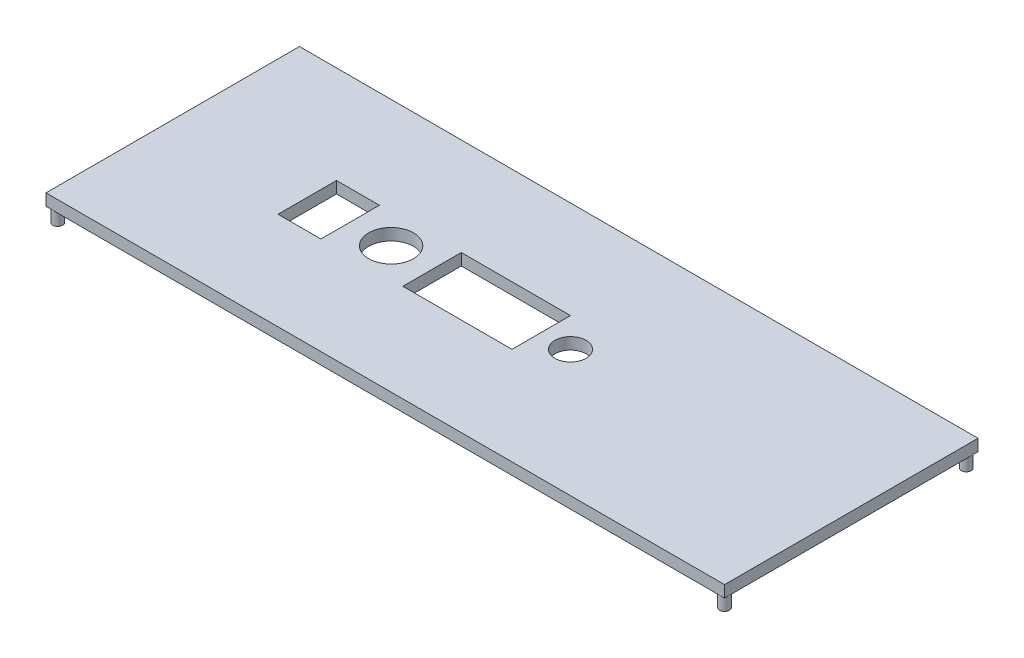
ISO-10303-21;
HEADER;
FILE_DESCRIPTION(('STEP AP214'),'2;1');
FILE_NAME('part.step','',(''),(''),'','','');
FILE_SCHEMA(('AUTOMOTIVE_DESIGN { 1 0 10303 214 1 1 1 1 }'));
ENDSEC;
DATA;
#1=APPLICATION_CONTEXT('core data for automotive mechanical design processes');
#2=APPLICATION_PROTOCOL_DEFINITION('international standard','automotive_design',2000,#1);
#3=PRODUCT_CONTEXT('',#1,'mechanical');
#4=PRODUCT('Part','Part','',(#3));
#5=PRODUCT_RELATED_PRODUCT_CATEGORY('part','',(#4));
#6=PRODUCT_DEFINITION_FORMATION('','',#4);
#7=PRODUCT_DEFINITION_CONTEXT('part definition',#1,'design');
#8=PRODUCT_DEFINITION('design','',#6,#7);
#9=PRODUCT_DEFINITION_SHAPE('','',#8);
#10=(LENGTH_UNIT() NAMED_UNIT(*) SI_UNIT(.MILLI.,.METRE.));
#11=(NAMED_UNIT(*) PLANE_ANGLE_UNIT() SI_UNIT($,.RADIAN.));
#12=(NAMED_UNIT(*) SI_UNIT($,.STERADIAN.) SOLID_ANGLE_UNIT());
#13=UNCERTAINTY_MEASURE_WITH_UNIT(LENGTH_MEASURE(1.E-05),#10,'distance_accuracy_value','');
#14=(GEOMETRIC_REPRESENTATION_CONTEXT(3) GLOBAL_UNCERTAINTY_ASSIGNED_CONTEXT((#13)) GLOBAL_UNIT_ASSIGNED_CONTEXT((#10,
#11,#12)) REPRESENTATION_CONTEXT('',''));
#15=CARTESIAN_POINT('',(0.,0.,0.));
#16=DIRECTION('',(0.,0.,1.));
#17=DIRECTION('',(1.,0.,0.));
#18=AXIS2_PLACEMENT_3D('',#15,#16,#17);
#19=CARTESIAN_POINT('',(108.565352112676,-3.5,29.2801408450704));
#20=DIRECTION('',(0.,-1.,0.));
#21=DIRECTION('',(0.,0.,-1.));
#22=AXIS2_PLACEMENT_3D('',#19,#20,#21);
#23=PLANE('',#22);
#24=CARTESIAN_POINT('',(108.565352112676,-3.5,29.2801408450704));
#25=DIRECTION('',(0.,-1.,0.));
#26=DIRECTION('',(0.,0.,-1.));
#27=AXIS2_PLACEMENT_3D('',#24,#25,#26);
#28=CIRCLE('',#27,1.25);
#29=CARTESIAN_POINT('',(108.565352112676,-3.5,28.0301408450704));
#30=VERTEX_POINT('',#29);
#31=EDGE_CURVE('E11',#30,#30,#28,.T.);
#32=ORIENTED_EDGE('',*,*,#31,.T.);
#33=EDGE_LOOP('',(#32));
#34=FACE_BOUND('',#33,.T.);
#35=ADVANCED_FACE('F33',(#34),#23,.T.);
#36=CARTESIAN_POINT('',(108.565352112676,-3.5,29.2801408450704));
#37=DIRECTION('',(0.,1.,0.));
#38=DIRECTION('',(0.,0.,1.));
#39=AXIS2_PLACEMENT_3D('',#36,#37,#38);
#40=CYLINDRICAL_SURFACE('',#39,1.25);
#41=ORIENTED_EDGE('',*,*,#31,.F.);
#42=EDGE_LOOP('',(#41));
#43=FACE_BOUND('',#42,.T.);
#44=CARTESIAN_POINT('',(108.565352112676,0.,29.2801408450704));
#45=DIRECTION('',(0.,1.,0.));
#46=DIRECTION('',(0.,0.,1.));
#47=AXIS2_PLACEMENT_3D('',#44,#45,#46);
#48=CIRCLE('',#47,1.25);
#49=CARTESIAN_POINT('',(108.565352112676,0.,30.5301408450704));
#50=VERTEX_POINT('',#49);
#51=EDGE_CURVE('E40',#50,#50,#48,.F.);
#52=ORIENTED_EDGE('',*,*,#51,.T.);
#53=EDGE_LOOP('',(#52));
#54=FACE_BOUND('',#53,.T.);
#55=ADVANCED_FACE('F245',(#43,#54),#40,.T.);
#56=CARTESIAN_POINT('',(-62.434647887324,-3.5,29.2801408450704));
#57=DIRECTION('',(0.,-1.,0.));
#58=DIRECTION('',(0.,0.,-1.));
#59=AXIS2_PLACEMENT_3D('',#56,#57,#58);
#60=PLANE('',#59);
#61=CARTESIAN_POINT('',(-62.434647887324,-3.5,29.2801408450704));
#62=DIRECTION('',(0.,-1.,0.));
#63=DIRECTION('',(0.,0.,-1.));
#64=AXIS2_PLACEMENT_3D('',#61,#62,#63);
#65=CIRCLE('',#64,1.25);
#66=CARTESIAN_POINT('',(-62.434647887324,-3.5,28.0301408450704));
#67=VERTEX_POINT('',#66);
#68=EDGE_CURVE('E240',#67,#67,#65,.T.);
#69=ORIENTED_EDGE('',*,*,#68,.T.);
#70=EDGE_LOOP('',(#69));
#71=FACE_BOUND('',#70,.T.);
#72=ADVANCED_FACE('F269',(#71),#60,.T.);
#73=CARTESIAN_POINT('',(-62.434647887324,-3.5,29.2801408450704));
#74=DIRECTION('',(0.,1.,0.));
#75=DIRECTION('',(0.,0.,1.));
#76=AXIS2_PLACEMENT_3D('',#73,#74,#75);
#77=CYLINDRICAL_SURFACE('',#76,1.25);
#78=ORIENTED_EDGE('',*,*,#68,.F.);
#79=EDGE_LOOP('',(#78));
#80=FACE_BOUND('',#79,.T.);
#81=CARTESIAN_POINT('',(-62.434647887324,0.,29.2801408450704));
#82=DIRECTION('',(0.,1.,0.));
#83=DIRECTION('',(0.,0.,1.));
#84=AXIS2_PLACEMENT_3D('',#81,#82,#83);
#85=CIRCLE('',#84,1.25);
#86=CARTESIAN_POINT('',(-62.434647887324,0.,30.5301408450704));
#87=VERTEX_POINT('',#86);
#88=EDGE_CURVE('E237',#87,#87,#85,.F.);
#89=ORIENTED_EDGE('',*,*,#88,.T.);
#90=EDGE_LOOP('',(#89));
#91=FACE_BOUND('',#90,.T.);
#92=ADVANCED_FACE('F275',(#80,#91),#77,.T.);
#93=CARTESIAN_POINT('',(-64.024647887324,3.,-34.3098591549296));
#94=DIRECTION('',(1.,0.,0.));
#95=DIRECTION('',(0.,0.,-1.));
#96=AXIS2_PLACEMENT_3D('',#93,#94,#95);
#97=PLANE('',#96);
#98=DIRECTION('',(0.,0.,1.));
#99=VECTOR('',#98,1.);
#100=CARTESIAN_POINT('',(-64.024647887324,0.,-34.3098591549296));
#101=LINE('',#100,#99);
#102=CARTESIAN_POINT('',(-64.024647887324,0.,-34.3098591549296));
#103=VERTEX_POINT('',#102);
#104=CARTESIAN_POINT('',(-64.024647887324,0.,30.6901408450704));
#105=VERTEX_POINT('',#104);
#106=EDGE_CURVE('E211',#103,#105,#101,.T.);
#107=ORIENTED_EDGE('',*,*,#106,.T.);
#108=DIRECTION('',(0.,-1.,0.));
#109=VECTOR('',#108,1.);
#110=CARTESIAN_POINT('',(-64.024647887324,3.,30.6901408450704));
#111=LINE('',#110,#109);
#112=CARTESIAN_POINT('',(-64.024647887324,3.,30.6901408450704));
#113=VERTEX_POINT('',#112);
#114=EDGE_CURVE('E228',#113,#105,#111,.T.);
#115=ORIENTED_EDGE('',*,*,#114,.F.);
#116=DIRECTION('',(0.,0.,1.));
#117=VECTOR('',#116,1.);
#118=CARTESIAN_POINT('',(-64.024647887324,3.,-34.3098591549296));
#119=LINE('',#118,#117);
#120=CARTESIAN_POINT('',(-64.024647887324,3.,-34.3098591549296));
#121=VERTEX_POINT('',#120);
#122=EDGE_CURVE('E200',#121,#113,#119,.T.);
#123=ORIENTED_EDGE('',*,*,#122,.F.);
#124=DIRECTION('',(0.,-1.,0.));
#125=VECTOR('',#124,1.);
#126=CARTESIAN_POINT('',(-64.024647887324,3.,-34.3098591549296));
#127=LINE('',#126,#125);
#128=EDGE_CURVE('E210',#121,#103,#127,.T.);
#129=ORIENTED_EDGE('',*,*,#128,.T.);
#130=EDGE_LOOP('',(#107,#115,#123,#129));
#131=FACE_BOUND('',#130,.T.);
#132=ADVANCED_FACE('F281',(#131),#97,.F.);
#133=CARTESIAN_POINT('',(-64.024647887324,3.,30.6901408450704));
#134=DIRECTION('',(0.,0.,-1.));
#135=DIRECTION('',(-1.,0.,0.));
#136=AXIS2_PLACEMENT_3D('',#133,#134,#135);
#137=PLANE('',#136);
#138=DIRECTION('',(1.,0.,0.));
#139=VECTOR('',#138,1.);
#140=CARTESIAN_POINT('',(-64.024647887324,0.,30.6901408450704));
#141=LINE('',#140,#139);
#142=CARTESIAN_POINT('',(109.975352112676,0.,30.6901408450704));
#143=VERTEX_POINT('',#142);
#144=EDGE_CURVE('E214',#105,#143,#141,.T.);
#145=ORIENTED_EDGE('',*,*,#144,.T.);
#146=DIRECTION('',(0.,-1.,0.));
#147=VECTOR('',#146,1.);
#148=CARTESIAN_POINT('',(109.975352112676,3.,30.6901408450704));
#149=LINE('',#148,#147);
#150=CARTESIAN_POINT('',(109.975352112676,3.,30.6901408450704));
#151=VERTEX_POINT('',#150);
#152=EDGE_CURVE('E225',#151,#143,#149,.T.);
#153=ORIENTED_EDGE('',*,*,#152,.F.);
#154=DIRECTION('',(1.,0.,0.));
#155=VECTOR('',#154,1.);
#156=CARTESIAN_POINT('',(-64.024647887324,3.,30.6901408450704));
#157=LINE('',#156,#155);
#158=EDGE_CURVE('E203',#113,#151,#157,.T.);
#159=ORIENTED_EDGE('',*,*,#158,.F.);
#160=ORIENTED_EDGE('',*,*,#114,.T.);
#161=EDGE_LOOP('',(#145,#153,#159,#160));
#162=FACE_BOUND('',#161,.T.);
#163=ADVANCED_FACE('F285',(#162),#137,.F.);
#164=CARTESIAN_POINT('',(109.975352112676,3.,-34.3098591549296));
#165=DIRECTION('',(-1.,0.,0.));
#166=DIRECTION('',(0.,0.,1.));
#167=AXIS2_PLACEMENT_3D('',#164,#165,#166);
#168=PLANE('',#167);
#169=DIRECTION('',(0.,0.,-1.));
#170=VECTOR('',#169,1.);
#171=CARTESIAN_POINT('',(109.975352112676,0.,-34.3098591549296));
#172=LINE('',#171,#170);
#173=CARTESIAN_POINT('',(109.975352112676,0.,-34.3098591549296));
#174=VERTEX_POINT('',#173);
#175=EDGE_CURVE('E217',#143,#174,#172,.T.);
#176=ORIENTED_EDGE('',*,*,#175,.T.);
#177=DIRECTION('',(0.,-1.,0.));
#178=VECTOR('',#177,1.);
#179=CARTESIAN_POINT('',(109.975352112676,3.,-34.3098591549296));
#180=LINE('',#179,#178);
#181=CARTESIAN_POINT('',(109.975352112676,3.,-34.3098591549296));
#182=VERTEX_POINT('',#181);
#183=EDGE_CURVE('E222',#182,#174,#180,.T.);
#184=ORIENTED_EDGE('',*,*,#183,.F.);
#185=DIRECTION('',(0.,0.,-1.));
#186=VECTOR('',#185,1.);
#187=CARTESIAN_POINT('',(109.975352112676,3.,-34.3098591549296));
#188=LINE('',#187,#186);
#189=EDGE_CURVE('E206',#151,#182,#188,.T.);
#190=ORIENTED_EDGE('',*,*,#189,.F.);
#191=ORIENTED_EDGE('',*,*,#152,.T.);
#192=EDGE_LOOP('',(#176,#184,#190,#191));
#193=FACE_BOUND('',#192,.T.);
#194=ADVANCED_FACE('F289',(#193),#168,.F.);
#195=CARTESIAN_POINT('',(-64.024647887324,3.,-34.3098591549296));
#196=DIRECTION('',(0.,0.,1.));
#197=DIRECTION('',(1.,0.,0.));
#198=AXIS2_PLACEMENT_3D('',#195,#196,#197);
#199=PLANE('',#198);
#200=DIRECTION('',(-1.,0.,0.));
#201=VECTOR('',#200,1.);
#202=CARTESIAN_POINT('',(-64.024647887324,0.,-34.3098591549296));
#203=LINE('',#202,#201);
#204=EDGE_CURVE('E204',#174,#103,#203,.T.);
#205=ORIENTED_EDGE('',*,*,#204,.T.);
#206=ORIENTED_EDGE('',*,*,#128,.F.);
#207=DIRECTION('',(-1.,0.,0.));
#208=VECTOR('',#207,1.);
#209=CARTESIAN_POINT('',(-64.024647887324,3.,-34.3098591549296));
#210=LINE('',#209,#208);
#211=EDGE_CURVE('E208',#182,#121,#210,.T.);
#212=ORIENTED_EDGE('',*,*,#211,.F.);
#213=ORIENTED_EDGE('',*,*,#183,.T.);
#214=EDGE_LOOP('',(#205,#206,#212,#213));
#215=FACE_BOUND('',#214,.T.);
#216=ADVANCED_FACE('F258',(#215),#199,.F.);
#217=CARTESIAN_POINT('',(0.,3.,0.));
#218=DIRECTION('',(0.,1.,0.));
#219=DIRECTION('',(0.,0.,1.));
#220=AXIS2_PLACEMENT_3D('',#217,#218,#219);
#221=PLANE('',#220);
#222=CARTESIAN_POINT('',(37.975352112676,3.,-1.80985915492958));
#223=DIRECTION('',(0.,1.,0.));
#224=DIRECTION('',(0.,0.,1.));
#225=AXIS2_PLACEMENT_3D('',#222,#223,#224);
#226=CIRCLE('',#225,4.00000000000001);
#227=CARTESIAN_POINT('',(37.975352112676,3.,2.19014084507043));
#228=VERTEX_POINT('',#227);
#229=EDGE_CURVE('E148',#228,#228,#226,.T.);
#230=ORIENTED_EDGE('',*,*,#229,.F.);
#231=EDGE_LOOP('',(#230));
#232=FACE_BOUND('',#231,.T.);
#233=DIRECTION('',(0.,0.,-1.));
#234=VECTOR('',#233,1.);
#235=CARTESIAN_POINT('',(30.475352112676,3.,5.69014084507042));
#236=LINE('',#235,#234);
#237=CARTESIAN_POINT('',(30.475352112676,3.,5.69014084507042));
#238=VERTEX_POINT('',#237);
#239=CARTESIAN_POINT('',(30.475352112676,3.,-9.30985915492958));
#240=VERTEX_POINT('',#239);
#241=EDGE_CURVE('E47',#238,#240,#236,.T.);
#242=ORIENTED_EDGE('',*,*,#241,.F.);
#243=DIRECTION('',(1.,0.,0.));
#244=VECTOR('',#243,1.);
#245=CARTESIAN_POINT('',(2.47535211267602,3.,5.69014084507042));
#246=LINE('',#245,#244);
#247=CARTESIAN_POINT('',(2.47535211267602,3.,5.69014084507042));
#248=VERTEX_POINT('',#247);
#249=EDGE_CURVE('E142',#248,#238,#246,.T.);
#250=ORIENTED_EDGE('',*,*,#249,.F.);
#251=DIRECTION('',(0.,0.,1.));
#252=VECTOR('',#251,1.);
#253=CARTESIAN_POINT('',(2.47535211267602,3.,5.69014084507042));
#254=LINE('',#253,#252);
#255=CARTESIAN_POINT('',(2.47535211267602,3.,-9.30985915492958));
#256=VERTEX_POINT('',#255);
#257=EDGE_CURVE('E145',#256,#248,#254,.T.);
#258=ORIENTED_EDGE('',*,*,#257,.F.);
#259=DIRECTION('',(-1.,0.,0.));
#260=VECTOR('',#259,1.);
#261=CARTESIAN_POINT('',(2.47535211267602,3.,-9.30985915492958));
#262=LINE('',#261,#260);
#263=EDGE_CURVE('E154',#240,#256,#262,.T.);
#264=ORIENTED_EDGE('',*,*,#263,.F.);
#265=EDGE_LOOP('',(#242,#250,#258,#264));
#266=FACE_BOUND('',#265,.T.);
#267=CARTESIAN_POINT('',(-8.02464788732397,3.,-1.80985915492958));
#268=DIRECTION('',(0.,1.,0.));
#269=DIRECTION('',(0.,0.,1.));
#270=AXIS2_PLACEMENT_3D('',#267,#268,#269);
#271=CIRCLE('',#270,5.75);
#272=CARTESIAN_POINT('',(-8.02464788732397,3.,3.94014084507042));
#273=VERTEX_POINT('',#272);
#274=EDGE_CURVE('E166',#273,#273,#271,.T.);
#275=ORIENTED_EDGE('',*,*,#274,.F.);
#276=EDGE_LOOP('',(#275));
#277=FACE_BOUND('',#276,.T.);
#278=DIRECTION('',(0.,0.,-1.));
#279=VECTOR('',#278,1.);
#280=CARTESIAN_POINT('',(-18.524647887324,3.,5.69014084507042));
#281=LINE('',#280,#279);
#282=CARTESIAN_POINT('',(-18.524647887324,3.,5.69014084507042));
#283=VERTEX_POINT('',#282);
#284=CARTESIAN_POINT('',(-18.524647887324,3.,-9.30985915492958));
#285=VERTEX_POINT('',#284);
#286=EDGE_CURVE('E55',#283,#285,#281,.T.);
#287=ORIENTED_EDGE('',*,*,#286,.F.);
#288=DIRECTION('',(1.,0.,0.));
#289=VECTOR('',#288,1.);
#290=CARTESIAN_POINT('',(-29.524647887324,3.,5.69014084507042));
#291=LINE('',#290,#289);
#292=CARTESIAN_POINT('',(-29.524647887324,3.,5.69014084507042));
#293=VERTEX_POINT('',#292);
#294=EDGE_CURVE('E174',#293,#283,#291,.T.);
#295=ORIENTED_EDGE('',*,*,#294,.F.);
#296=DIRECTION('',(0.,0.,1.));
#297=VECTOR('',#296,1.);
#298=CARTESIAN_POINT('',(-29.524647887324,3.,5.69014084507042));
#299=LINE('',#298,#297);
#300=CARTESIAN_POINT('',(-29.524647887324,3.,-9.30985915492958));
#301=VERTEX_POINT('',#300);
#302=EDGE_CURVE('E189',#301,#293,#299,.T.);
#303=ORIENTED_EDGE('',*,*,#302,.F.);
#304=DIRECTION('',(-1.,0.,0.));
#305=VECTOR('',#304,1.);
#306=CARTESIAN_POINT('',(-29.524647887324,3.,-9.30985915492958));
#307=LINE('',#306,#305);
#308=EDGE_CURVE('E185',#285,#301,#307,.T.);
#309=ORIENTED_EDGE('',*,*,#308,.F.);
#310=EDGE_LOOP('',(#287,#295,#303,#309));
#311=FACE_BOUND('',#310,.T.);
#312=ORIENTED_EDGE('',*,*,#122,.T.);
#313=ORIENTED_EDGE('',*,*,#158,.T.);
#314=ORIENTED_EDGE('',*,*,#189,.T.);
#315=ORIENTED_EDGE('',*,*,#211,.T.);
#316=EDGE_LOOP('',(#312,#313,#314,#315));
#317=FACE_BOUND('',#316,.T.);
#318=ADVANCED_FACE('F249',(#232,#266,#277,#311,#317),#221,.T.);
#319=CARTESIAN_POINT('',(0.,0.,0.));
#320=DIRECTION('',(0.,1.,0.));
#321=DIRECTION('',(0.,0.,1.));
#322=AXIS2_PLACEMENT_3D('',#319,#320,#321);
#323=PLANE('',#322);
#324=CARTESIAN_POINT('',(108.565352112676,0.,-32.7198591549296));
#325=DIRECTION('',(0.,1.,0.));
#326=DIRECTION('',(0.,0.,1.));
#327=AXIS2_PLACEMENT_3D('',#324,#325,#326);
#328=CIRCLE('',#327,1.25);
#329=CARTESIAN_POINT('',(108.565352112676,0.,-31.4698591549296));
#330=VERTEX_POINT('',#329);
#331=EDGE_CURVE('E234',#330,#330,#328,.F.);
#332=ORIENTED_EDGE('',*,*,#331,.F.);
#333=EDGE_LOOP('',(#332));
#334=FACE_BOUND('',#333,.T.);
#335=CARTESIAN_POINT('',(-62.434647887324,0.,-32.7198591549296));
#336=DIRECTION('',(0.,1.,0.));
#337=DIRECTION('',(0.,0.,1.));
#338=AXIS2_PLACEMENT_3D('',#335,#336,#337);
#339=CIRCLE('',#338,1.25);
#340=CARTESIAN_POINT('',(-62.434647887324,0.,-31.4698591549296));
#341=VERTEX_POINT('',#340);
#342=EDGE_CURVE('E231',#341,#341,#339,.F.);
#343=ORIENTED_EDGE('',*,*,#342,.F.);
#344=EDGE_LOOP('',(#343));
#345=FACE_BOUND('',#344,.T.);
#346=CARTESIAN_POINT('',(37.975352112676,0.,-1.80985915492958));
#347=DIRECTION('',(0.,1.,0.));
#348=DIRECTION('',(0.,0.,1.));
#349=AXIS2_PLACEMENT_3D('',#346,#347,#348);
#350=CIRCLE('',#349,4.00000000000001);
#351=CARTESIAN_POINT('',(37.975352112676,0.,2.19014084507043));
#352=VERTEX_POINT('',#351);
#353=EDGE_CURVE('E215',#352,#352,#350,.T.);
#354=ORIENTED_EDGE('',*,*,#353,.T.);
#355=EDGE_LOOP('',(#354));
#356=FACE_BOUND('',#355,.T.);
#357=DIRECTION('',(1.,0.,0.));
#358=VECTOR('',#357,1.);
#359=CARTESIAN_POINT('',(2.47535211267602,0.,5.69014084507042));
#360=LINE('',#359,#358);
#361=CARTESIAN_POINT('',(2.47535211267602,0.,5.69014084507042));
#362=VERTEX_POINT('',#361);
#363=CARTESIAN_POINT('',(30.475352112676,0.,5.69014084507042));
#364=VERTEX_POINT('',#363);
#365=EDGE_CURVE('E129',#362,#364,#360,.T.);
#366=ORIENTED_EDGE('',*,*,#365,.T.);
#367=DIRECTION('',(0.,0.,-1.));
#368=VECTOR('',#367,1.);
#369=CARTESIAN_POINT('',(30.475352112676,0.,5.69014084507042));
#370=LINE('',#369,#368);
#371=CARTESIAN_POINT('',(30.475352112676,0.,-9.30985915492958));
#372=VERTEX_POINT('',#371);
#373=EDGE_CURVE('E123',#364,#372,#370,.T.);
#374=ORIENTED_EDGE('',*,*,#373,.T.);
#375=DIRECTION('',(-1.,0.,0.));
#376=VECTOR('',#375,1.);
#377=CARTESIAN_POINT('',(2.47535211267602,0.,-9.30985915492958));
#378=LINE('',#377,#376);
#379=CARTESIAN_POINT('',(2.47535211267602,0.,-9.30985915492958));
#380=VERTEX_POINT('',#379);
#381=EDGE_CURVE('E133',#372,#380,#378,.T.);
#382=ORIENTED_EDGE('',*,*,#381,.T.);
#383=DIRECTION('',(0.,0.,1.));
#384=VECTOR('',#383,1.);
#385=CARTESIAN_POINT('',(2.47535211267602,0.,5.69014084507042));
#386=LINE('',#385,#384);
#387=EDGE_CURVE('E137',#380,#362,#386,.T.);
#388=ORIENTED_EDGE('',*,*,#387,.T.);
#389=EDGE_LOOP('',(#366,#374,#382,#388));
#390=FACE_BOUND('',#389,.T.);
#391=CARTESIAN_POINT('',(-8.02464788732397,0.,-1.80985915492958));
#392=DIRECTION('',(0.,1.,0.));
#393=DIRECTION('',(0.,0.,1.));
#394=AXIS2_PLACEMENT_3D('',#391,#392,#393);
#395=CIRCLE('',#394,5.75);
#396=CARTESIAN_POINT('',(-8.02464788732397,0.,3.94014084507042));
#397=VERTEX_POINT('',#396);
#398=EDGE_CURVE('E155',#397,#397,#395,.T.);
#399=ORIENTED_EDGE('',*,*,#398,.T.);
#400=EDGE_LOOP('',(#399));
#401=FACE_BOUND('',#400,.T.);
#402=DIRECTION('',(1.,0.,0.));
#403=VECTOR('',#402,1.);
#404=CARTESIAN_POINT('',(-29.524647887324,0.,5.69014084507042));
#405=LINE('',#404,#403);
#406=CARTESIAN_POINT('',(-29.524647887324,0.,5.69014084507042));
#407=VERTEX_POINT('',#406);
#408=CARTESIAN_POINT('',(-18.524647887324,0.,5.69014084507042));
#409=VERTEX_POINT('',#408);
#410=EDGE_CURVE('E180',#407,#409,#405,.T.);
#411=ORIENTED_EDGE('',*,*,#410,.T.);
#412=DIRECTION('',(0.,0.,-1.));
#413=VECTOR('',#412,1.);
#414=CARTESIAN_POINT('',(-18.524647887324,0.,5.69014084507042));
#415=LINE('',#414,#413);
#416=CARTESIAN_POINT('',(-18.524647887324,0.,-9.30985915492958));
#417=VERTEX_POINT('',#416);
#418=EDGE_CURVE('E170',#409,#417,#415,.T.);
#419=ORIENTED_EDGE('',*,*,#418,.T.);
#420=DIRECTION('',(-1.,0.,0.));
#421=VECTOR('',#420,1.);
#422=CARTESIAN_POINT('',(-29.524647887324,0.,-9.30985915492958));
#423=LINE('',#422,#421);
#424=CARTESIAN_POINT('',(-29.524647887324,0.,-9.30985915492958));
#425=VERTEX_POINT('',#424);
#426=EDGE_CURVE('E173',#417,#425,#423,.T.);
#427=ORIENTED_EDGE('',*,*,#426,.T.);
#428=DIRECTION('',(0.,0.,1.));
#429=VECTOR('',#428,1.);
#430=CARTESIAN_POINT('',(-29.524647887324,0.,5.69014084507042));
#431=LINE('',#430,#429);
#432=EDGE_CURVE('E177',#425,#407,#431,.T.);
#433=ORIENTED_EDGE('',*,*,#432,.T.);
#434=EDGE_LOOP('',(#411,#419,#427,#433));
#435=FACE_BOUND('',#434,.T.);
#436=ORIENTED_EDGE('',*,*,#106,.F.);
#437=ORIENTED_EDGE('',*,*,#204,.F.);
#438=ORIENTED_EDGE('',*,*,#175,.F.);
#439=ORIENTED_EDGE('',*,*,#144,.F.);
#440=EDGE_LOOP('',(#436,#437,#438,#439));
#441=FACE_BOUND('',#440,.T.);
#442=ORIENTED_EDGE('',*,*,#88,.F.);
#443=EDGE_LOOP('',(#442));
#444=FACE_BOUND('',#443,.T.);
#445=ORIENTED_EDGE('',*,*,#51,.F.);
#446=EDGE_LOOP('',(#445));
#447=FACE_BOUND('',#446,.T.);
#448=ADVANCED_FACE('F139',(#334,#345,#356,#390,#401,#435,#441,#444,#447),#323,.F.);
#449=CARTESIAN_POINT('',(-18.524647887324,0.,5.69014084507042));
#450=DIRECTION('',(1.,0.,0.));
#451=DIRECTION('',(0.,0.,-1.));
#452=AXIS2_PLACEMENT_3D('',#449,#450,#451);
#453=PLANE('',#452);
#454=ORIENTED_EDGE('',*,*,#286,.T.);
#455=DIRECTION('',(0.,1.,0.));
#456=VECTOR('',#455,1.);
#457=CARTESIAN_POINT('',(-18.524647887324,0.,-9.30985915492958));
#458=LINE('',#457,#456);
#459=EDGE_CURVE('E183',#417,#285,#458,.T.);
#460=ORIENTED_EDGE('',*,*,#459,.F.);
#461=ORIENTED_EDGE('',*,*,#418,.F.);
#462=DIRECTION('',(0.,1.,0.));
#463=VECTOR('',#462,1.);
#464=CARTESIAN_POINT('',(-18.524647887324,0.,5.69014084507042));
#465=LINE('',#464,#463);
#466=EDGE_CURVE('E169',#409,#283,#465,.T.);
#467=ORIENTED_EDGE('',*,*,#466,.T.);
#468=EDGE_LOOP('',(#454,#460,#461,#467));
#469=FACE_BOUND('',#468,.T.);
#470=ADVANCED_FACE('F248',(#469),#453,.F.);
#471=CARTESIAN_POINT('',(-29.524647887324,0.,5.69014084507042));
#472=DIRECTION('',(0.,0.,1.));
#473=DIRECTION('',(1.,0.,0.));
#474=AXIS2_PLACEMENT_3D('',#471,#472,#473);
#475=PLANE('',#474);
#476=ORIENTED_EDGE('',*,*,#294,.T.);
#477=ORIENTED_EDGE('',*,*,#466,.F.);
#478=ORIENTED_EDGE('',*,*,#410,.F.);
#479=DIRECTION('',(0.,1.,0.));
#480=VECTOR('',#479,1.);
#481=CARTESIAN_POINT('',(-29.524647887324,0.,5.69014084507042));
#482=LINE('',#481,#480);
#483=EDGE_CURVE('E195',#407,#293,#482,.T.);
#484=ORIENTED_EDGE('',*,*,#483,.T.);
#485=EDGE_LOOP('',(#476,#477,#478,#484));
#486=FACE_BOUND('',#485,.T.);
#487=ADVANCED_FACE('F256',(#486),#475,.F.);
#488=CARTESIAN_POINT('',(-29.524647887324,0.,5.69014084507042));
#489=DIRECTION('',(-1.,0.,0.));
#490=DIRECTION('',(0.,0.,1.));
#491=AXIS2_PLACEMENT_3D('',#488,#489,#490);
#492=PLANE('',#491);
#493=ORIENTED_EDGE('',*,*,#302,.T.);
#494=ORIENTED_EDGE('',*,*,#483,.F.);
#495=ORIENTED_EDGE('',*,*,#432,.F.);
#496=DIRECTION('',(0.,1.,0.));
#497=VECTOR('',#496,1.);
#498=CARTESIAN_POINT('',(-29.524647887324,0.,-9.30985915492958));
#499=LINE('',#498,#497);
#500=EDGE_CURVE('E197',#425,#301,#499,.T.);
#501=ORIENTED_EDGE('',*,*,#500,.T.);
#502=EDGE_LOOP('',(#493,#494,#495,#501));
#503=FACE_BOUND('',#502,.T.);
#504=ADVANCED_FACE('F334',(#503),#492,.F.);
#505=CARTESIAN_POINT('',(-29.524647887324,0.,-9.30985915492958));
#506=DIRECTION('',(0.,0.,-1.));
#507=DIRECTION('',(-1.,0.,0.));
#508=AXIS2_PLACEMENT_3D('',#505,#506,#507);
#509=PLANE('',#508);
#510=ORIENTED_EDGE('',*,*,#308,.T.);
#511=ORIENTED_EDGE('',*,*,#500,.F.);
#512=ORIENTED_EDGE('',*,*,#426,.F.);
#513=ORIENTED_EDGE('',*,*,#459,.T.);
#514=EDGE_LOOP('',(#510,#511,#512,#513));
#515=FACE_BOUND('',#514,.T.);
#516=ADVANCED_FACE('F344',(#515),#509,.F.);
#517=CARTESIAN_POINT('',(-8.02464788732397,0.,-1.80985915492958));
#518=DIRECTION('',(0.,1.,0.));
#519=DIRECTION('',(0.,0.,1.));
#520=AXIS2_PLACEMENT_3D('',#517,#518,#519);
#521=CYLINDRICAL_SURFACE('',#520,5.75);
#522=ORIENTED_EDGE('',*,*,#398,.F.);
#523=EDGE_LOOP('',(#522));
#524=FACE_BOUND('',#523,.T.);
#525=ORIENTED_EDGE('',*,*,#274,.T.);
#526=EDGE_LOOP('',(#525));
#527=FACE_BOUND('',#526,.T.);
#528=ADVANCED_FACE('F354',(#524,#527),#521,.F.);
#529=CARTESIAN_POINT('',(30.475352112676,0.,5.69014084507042));
#530=DIRECTION('',(1.,0.,0.));
#531=DIRECTION('',(0.,0.,-1.));
#532=AXIS2_PLACEMENT_3D('',#529,#530,#531);
#533=PLANE('',#532);
#534=ORIENTED_EDGE('',*,*,#241,.T.);
#535=DIRECTION('',(0.,1.,0.));
#536=VECTOR('',#535,1.);
#537=CARTESIAN_POINT('',(30.475352112676,0.,-9.30985915492958));
#538=LINE('',#537,#536);
#539=EDGE_CURVE('E119',#372,#240,#538,.T.);
#540=ORIENTED_EDGE('',*,*,#539,.F.);
#541=ORIENTED_EDGE('',*,*,#373,.F.);
#542=DIRECTION('',(0.,1.,0.));
#543=VECTOR('',#542,1.);
#544=CARTESIAN_POINT('',(30.475352112676,0.,5.69014084507042));
#545=LINE('',#544,#543);
#546=EDGE_CURVE('E159',#364,#238,#545,.T.);
#547=ORIENTED_EDGE('',*,*,#546,.T.);
#548=EDGE_LOOP('',(#534,#540,#541,#547));
#549=FACE_BOUND('',#548,.T.);
#550=ADVANCED_FACE('F121',(#549),#533,.F.);
#551=CARTESIAN_POINT('',(2.47535211267602,0.,5.69014084507042));
#552=DIRECTION('',(0.,0.,1.));
#553=DIRECTION('',(1.,0.,0.));
#554=AXIS2_PLACEMENT_3D('',#551,#552,#553);
#555=PLANE('',#554);
#556=ORIENTED_EDGE('',*,*,#249,.T.);
#557=ORIENTED_EDGE('',*,*,#546,.F.);
#558=ORIENTED_EDGE('',*,*,#365,.F.);
#559=DIRECTION('',(0.,1.,0.));
#560=VECTOR('',#559,1.);
#561=CARTESIAN_POINT('',(2.47535211267602,0.,5.69014084507042));
#562=LINE('',#561,#560);
#563=EDGE_CURVE('E161',#362,#248,#562,.T.);
#564=ORIENTED_EDGE('',*,*,#563,.T.);
#565=EDGE_LOOP('',(#556,#557,#558,#564));
#566=FACE_BOUND('',#565,.T.);
#567=ADVANCED_FACE('F373',(#566),#555,.F.);
#568=CARTESIAN_POINT('',(2.47535211267602,0.,5.69014084507042));
#569=DIRECTION('',(-1.,0.,0.));
#570=DIRECTION('',(0.,0.,1.));
#571=AXIS2_PLACEMENT_3D('',#568,#569,#570);
#572=PLANE('',#571);
#573=ORIENTED_EDGE('',*,*,#257,.T.);
#574=ORIENTED_EDGE('',*,*,#563,.F.);
#575=ORIENTED_EDGE('',*,*,#387,.F.);
#576=DIRECTION('',(0.,1.,0.));
#577=VECTOR('',#576,1.);
#578=CARTESIAN_POINT('',(2.47535211267602,0.,-9.30985915492958));
#579=LINE('',#578,#577);
#580=EDGE_CURVE('E128',#380,#256,#579,.T.);
#581=ORIENTED_EDGE('',*,*,#580,.T.);
#582=EDGE_LOOP('',(#573,#574,#575,#581));
#583=FACE_BOUND('',#582,.T.);
#584=ADVANCED_FACE('F382',(#583),#572,.F.);
#585=CARTESIAN_POINT('',(2.47535211267602,0.,-9.30985915492958));
#586=DIRECTION('',(0.,0.,-1.));
#587=DIRECTION('',(-1.,0.,0.));
#588=AXIS2_PLACEMENT_3D('',#585,#586,#587);
#589=PLANE('',#588);
#590=ORIENTED_EDGE('',*,*,#263,.T.);
#591=ORIENTED_EDGE('',*,*,#580,.F.);
#592=ORIENTED_EDGE('',*,*,#381,.F.);
#593=ORIENTED_EDGE('',*,*,#539,.T.);
#594=EDGE_LOOP('',(#590,#591,#592,#593));
#595=FACE_BOUND('',#594,.T.);
#596=ADVANCED_FACE('F134',(#595),#589,.F.);
#597=CARTESIAN_POINT('',(37.975352112676,0.,-1.80985915492958));
#598=DIRECTION('',(0.,1.,0.));
#599=DIRECTION('',(0.,0.,1.));
#600=AXIS2_PLACEMENT_3D('',#597,#598,#599);
#601=CYLINDRICAL_SURFACE('',#600,4.00000000000001);
#602=ORIENTED_EDGE('',*,*,#353,.F.);
#603=EDGE_LOOP('',(#602));
#604=FACE_BOUND('',#603,.T.);
#605=ORIENTED_EDGE('',*,*,#229,.T.);
#606=EDGE_LOOP('',(#605));
#607=FACE_BOUND('',#606,.T.);
#608=ADVANCED_FACE('F401',(#604,#607),#601,.F.);
#609=CARTESIAN_POINT('',(-62.434647887324,-3.5,-32.7198591549296));
#610=DIRECTION('',(0.,1.,0.));
#611=DIRECTION('',(0.,0.,1.));
#612=AXIS2_PLACEMENT_3D('',#609,#610,#611);
#613=CYLINDRICAL_SURFACE('',#612,1.25);
#614=CARTESIAN_POINT('',(-62.434647887324,-3.5,-32.7198591549296));
#615=DIRECTION('',(0.,-1.,0.));
#616=DIRECTION('',(0.,0.,-1.));
#617=AXIS2_PLACEMENT_3D('',#614,#615,#616);
#618=CIRCLE('',#617,1.25);
#619=CARTESIAN_POINT('',(-62.434647887324,-3.5,-33.9698591549296));
#620=VERTEX_POINT('',#619);
#621=EDGE_CURVE('E186',#620,#620,#618,.T.);
#622=ORIENTED_EDGE('',*,*,#621,.F.);
#623=EDGE_LOOP('',(#622));
#624=FACE_BOUND('',#623,.T.);
#625=ORIENTED_EDGE('',*,*,#342,.T.);
#626=EDGE_LOOP('',(#625));
#627=FACE_BOUND('',#626,.T.);
#628=ADVANCED_FACE('F410',(#624,#627),#613,.T.);
#629=CARTESIAN_POINT('',(-62.434647887324,-3.5,-32.7198591549296));
#630=DIRECTION('',(0.,-1.,0.));
#631=DIRECTION('',(0.,0.,-1.));
#632=AXIS2_PLACEMENT_3D('',#629,#630,#631);
#633=PLANE('',#632);
#634=ORIENTED_EDGE('',*,*,#621,.T.);
#635=EDGE_LOOP('',(#634));
#636=FACE_BOUND('',#635,.T.);
#637=ADVANCED_FACE('F420',(#636),#633,.T.);
#638=CARTESIAN_POINT('',(108.565352112676,-3.5,-32.7198591549296));
#639=DIRECTION('',(0.,1.,0.));
#640=DIRECTION('',(0.,0.,1.));
#641=AXIS2_PLACEMENT_3D('',#638,#639,#640);
#642=CYLINDRICAL_SURFACE('',#641,1.25);
#643=CARTESIAN_POINT('',(108.565352112676,-3.5,-32.7198591549296));
#644=DIRECTION('',(0.,-1.,0.));
#645=DIRECTION('',(0.,0.,-1.));
#646=AXIS2_PLACEMENT_3D('',#643,#644,#645);
#647=CIRCLE('',#646,1.25);
#648=CARTESIAN_POINT('',(108.565352112676,-3.5,-33.9698591549296));
#649=VERTEX_POINT('',#648);
#650=EDGE_CURVE('E479',#649,#649,#647,.T.);
#651=ORIENTED_EDGE('',*,*,#650,.F.);
#652=EDGE_LOOP('',(#651));
#653=FACE_BOUND('',#652,.T.);
#654=ORIENTED_EDGE('',*,*,#331,.T.);
#655=EDGE_LOOP('',(#654));
#656=FACE_BOUND('',#655,.T.);
#657=ADVANCED_FACE('F429',(#653,#656),#642,.T.);
#658=CARTESIAN_POINT('',(108.565352112676,-3.5,-32.7198591549296));
#659=DIRECTION('',(0.,-1.,0.));
#660=DIRECTION('',(0.,0.,-1.));
#661=AXIS2_PLACEMENT_3D('',#658,#659,#660);
#662=PLANE('',#661);
#663=ORIENTED_EDGE('',*,*,#650,.T.);
#664=EDGE_LOOP('',(#663));
#665=FACE_BOUND('',#664,.T.);
#666=ADVANCED_FACE('F463',(#665),#662,.T.);
#667=CLOSED_SHELL('',(#35,#55,#72,#92,#132,#163,#194,#216,#318,#448,#470,#487,#504,#516,#528,
#550,#567,#584,#596,#608,#628,#637,#657,#666));
#668=MANIFOLD_SOLID_BREP('B2',#667);
#669=ADVANCED_BREP_SHAPE_REPRESENTATION('',(#18,#668),#14);
#670=SHAPE_DEFINITION_REPRESENTATION(#9,#669);
ENDSEC;
END-ISO-10303-21;
